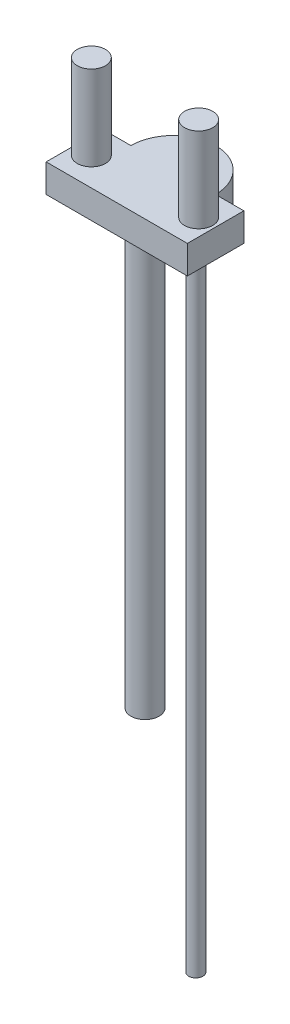
ISO-10303-21;
HEADER;
FILE_DESCRIPTION(('STEP AP214'),'2;1');
FILE_NAME('part.step','',(''),(''),'','','');
FILE_SCHEMA(('AUTOMOTIVE_DESIGN { 1 0 10303 214 1 1 1 1 }'));
ENDSEC;
DATA;
#1=APPLICATION_CONTEXT('core data for automotive mechanical design processes');
#2=APPLICATION_PROTOCOL_DEFINITION('international standard','automotive_design',2000,#1);
#3=PRODUCT_CONTEXT('',#1,'mechanical');
#4=PRODUCT('Part','Part','',(#3));
#5=PRODUCT_RELATED_PRODUCT_CATEGORY('part','',(#4));
#6=PRODUCT_DEFINITION_FORMATION('','',#4);
#7=PRODUCT_DEFINITION_CONTEXT('part definition',#1,'design');
#8=PRODUCT_DEFINITION('design','',#6,#7);
#9=PRODUCT_DEFINITION_SHAPE('','',#8);
#10=(LENGTH_UNIT() NAMED_UNIT(*) SI_UNIT(.MILLI.,.METRE.));
#11=(NAMED_UNIT(*) PLANE_ANGLE_UNIT() SI_UNIT($,.RADIAN.));
#12=(NAMED_UNIT(*) SI_UNIT($,.STERADIAN.) SOLID_ANGLE_UNIT());
#13=UNCERTAINTY_MEASURE_WITH_UNIT(LENGTH_MEASURE(1.E-05),#10,'distance_accuracy_value','');
#14=(GEOMETRIC_REPRESENTATION_CONTEXT(3) GLOBAL_UNCERTAINTY_ASSIGNED_CONTEXT((#13)) GLOBAL_UNIT_ASSIGNED_CONTEXT((#10,
#11,#12)) REPRESENTATION_CONTEXT('',''));
#15=CARTESIAN_POINT('',(0.,0.,0.));
#16=DIRECTION('',(0.,0.,1.));
#17=DIRECTION('',(1.,0.,0.));
#18=AXIS2_PLACEMENT_3D('',#15,#16,#17);
#19=CARTESIAN_POINT('',(-25.,160.,-10.));
#20=DIRECTION('',(0.,0.,1.));
#21=DIRECTION('',(1.,0.,0.));
#22=AXIS2_PLACEMENT_3D('',#19,#20,#21);
#23=PLANE('',#22);
#24=DIRECTION('',(-1.,0.,0.));
#25=VECTOR('',#24,1.);
#26=CARTESIAN_POINT('',(-25.,150.,-10.));
#27=LINE('',#26,#25);
#28=CARTESIAN_POINT('',(25.,150.,-10.));
#29=VERTEX_POINT('',#28);
#30=CARTESIAN_POINT('',(15.,150.,-10.));
#31=VERTEX_POINT('',#30);
#32=EDGE_CURVE('E97',#29,#31,#27,.T.);
#33=ORIENTED_EDGE('',*,*,#32,.T.);
#34=DIRECTION('',(0.,1.,0.));
#35=VECTOR('',#34,1.);
#36=CARTESIAN_POINT('',(15.,150.,-10.));
#37=LINE('',#36,#35);
#38=CARTESIAN_POINT('',(15.,160.,-10.));
#39=VERTEX_POINT('',#38);
#40=EDGE_CURVE('E58',#31,#39,#37,.T.);
#41=ORIENTED_EDGE('',*,*,#40,.T.);
#42=DIRECTION('',(-1.,0.,0.));
#43=VECTOR('',#42,1.);
#44=CARTESIAN_POINT('',(-25.,160.,-10.));
#45=LINE('',#44,#43);
#46=CARTESIAN_POINT('',(25.,160.,-10.));
#47=VERTEX_POINT('',#46);
#48=EDGE_CURVE('E130',#47,#39,#45,.T.);
#49=ORIENTED_EDGE('',*,*,#48,.F.);
#50=DIRECTION('',(0.,-1.,0.));
#51=VECTOR('',#50,1.);
#52=CARTESIAN_POINT('',(25.,160.,-10.));
#53=LINE('',#52,#51);
#54=EDGE_CURVE('E148',#47,#29,#53,.T.);
#55=ORIENTED_EDGE('',*,*,#54,.T.);
#56=EDGE_LOOP('',(#33,#41,#49,#55));
#57=FACE_BOUND('',#56,.T.);
#58=ADVANCED_FACE('F33',(#57),#23,.F.);
#59=CARTESIAN_POINT('',(0.,150.,0.));
#60=DIRECTION('',(0.,-1.,0.));
#61=DIRECTION('',(0.,0.,-1.));
#62=AXIS2_PLACEMENT_3D('',#59,#60,#61);
#63=CYLINDRICAL_SURFACE('',#62,5.);
#64=CARTESIAN_POINT('',(0.,150.,0.));
#65=DIRECTION('',(0.,1.,0.));
#66=DIRECTION('',(0.,0.,1.));
#67=AXIS2_PLACEMENT_3D('',#64,#65,#66);
#68=CIRCLE('',#67,5.);
#69=CARTESIAN_POINT('',(0.,150.,5.));
#70=VERTEX_POINT('',#69);
#71=EDGE_CURVE('E11',#70,#70,#68,.T.);
#72=ORIENTED_EDGE('',*,*,#71,.F.);
#73=EDGE_LOOP('',(#72));
#74=FACE_BOUND('',#73,.T.);
#75=CARTESIAN_POINT('',(0.,0.,0.));
#76=DIRECTION('',(0.,1.,0.));
#77=DIRECTION('',(0.,0.,1.));
#78=AXIS2_PLACEMENT_3D('',#75,#76,#77);
#79=CIRCLE('',#78,5.);
#80=CARTESIAN_POINT('',(0.,0.,5.));
#81=VERTEX_POINT('',#80);
#82=EDGE_CURVE('E42',#81,#81,#79,.T.);
#83=ORIENTED_EDGE('',*,*,#82,.T.);
#84=EDGE_LOOP('',(#83));
#85=FACE_BOUND('',#84,.T.);
#86=ADVANCED_FACE('F35',(#74,#85),#63,.T.);
#87=CARTESIAN_POINT('',(0.,0.,0.));
#88=DIRECTION('',(0.,1.,0.));
#89=DIRECTION('',(0.,0.,1.));
#90=AXIS2_PLACEMENT_3D('',#87,#88,#89);
#91=PLANE('',#90);
#92=ORIENTED_EDGE('',*,*,#82,.F.);
#93=EDGE_LOOP('',(#92));
#94=FACE_BOUND('',#93,.T.);
#95=ADVANCED_FACE('F154',(#94),#91,.F.);
#96=CARTESIAN_POINT('',(25.,160.,-10.));
#97=DIRECTION('',(-1.,0.,0.));
#98=DIRECTION('',(0.,0.,1.));
#99=AXIS2_PLACEMENT_3D('',#96,#97,#98);
#100=PLANE('',#99);
#101=DIRECTION('',(0.,0.,-1.));
#102=VECTOR('',#101,1.);
#103=CARTESIAN_POINT('',(25.,150.,-10.));
#104=LINE('',#103,#102);
#105=CARTESIAN_POINT('',(25.,150.,10.));
#106=VERTEX_POINT('',#105);
#107=EDGE_CURVE('E98',#106,#29,#104,.T.);
#108=ORIENTED_EDGE('',*,*,#107,.T.);
#109=ORIENTED_EDGE('',*,*,#54,.F.);
#110=DIRECTION('',(0.,0.,-1.));
#111=VECTOR('',#110,1.);
#112=CARTESIAN_POINT('',(25.,160.,-10.));
#113=LINE('',#112,#111);
#114=CARTESIAN_POINT('',(25.,160.,10.));
#115=VERTEX_POINT('',#114);
#116=EDGE_CURVE('E126',#115,#47,#113,.T.);
#117=ORIENTED_EDGE('',*,*,#116,.F.);
#118=DIRECTION('',(0.,-1.,0.));
#119=VECTOR('',#118,1.);
#120=CARTESIAN_POINT('',(25.,160.,10.));
#121=LINE('',#120,#119);
#122=EDGE_CURVE('E136',#115,#106,#121,.T.);
#123=ORIENTED_EDGE('',*,*,#122,.T.);
#124=EDGE_LOOP('',(#108,#109,#117,#123));
#125=FACE_BOUND('',#124,.T.);
#126=ADVANCED_FACE('F156',(#125),#100,.F.);
#127=CARTESIAN_POINT('',(-15.,160.,-10.));
#128=VERTEX_POINT('',#127);
#129=CARTESIAN_POINT('',(-25.,160.,-10.));
#130=VERTEX_POINT('',#129);
#131=EDGE_CURVE('E50',#128,#130,#45,.T.);
#132=ORIENTED_EDGE('',*,*,#131,.F.);
#133=DIRECTION('',(0.,1.,0.));
#134=VECTOR('',#133,1.);
#135=CARTESIAN_POINT('',(-15.,150.,-10.));
#136=LINE('',#135,#134);
#137=CARTESIAN_POINT('',(-15.,150.,-10.));
#138=VERTEX_POINT('',#137);
#139=EDGE_CURVE('E100',#138,#128,#136,.T.);
#140=ORIENTED_EDGE('',*,*,#139,.F.);
#141=CARTESIAN_POINT('',(-25.,150.,-10.));
#142=VERTEX_POINT('',#141);
#143=EDGE_CURVE('E89',#138,#142,#27,.T.);
#144=ORIENTED_EDGE('',*,*,#143,.T.);
#145=DIRECTION('',(0.,-1.,0.));
#146=VECTOR('',#145,1.);
#147=CARTESIAN_POINT('',(-25.,160.,-10.));
#148=LINE('',#147,#146);
#149=EDGE_CURVE('E146',#130,#142,#148,.T.);
#150=ORIENTED_EDGE('',*,*,#149,.F.);
#151=EDGE_LOOP('',(#132,#140,#144,#150));
#152=FACE_BOUND('',#151,.T.);
#153=ADVANCED_FACE('F101',(#152),#23,.F.);
#154=CARTESIAN_POINT('',(-25.,160.,-10.));
#155=DIRECTION('',(1.,0.,0.));
#156=DIRECTION('',(0.,0.,-1.));
#157=AXIS2_PLACEMENT_3D('',#154,#155,#156);
#158=PLANE('',#157);
#159=DIRECTION('',(0.,0.,1.));
#160=VECTOR('',#159,1.);
#161=CARTESIAN_POINT('',(-25.,150.,-10.));
#162=LINE('',#161,#160);
#163=CARTESIAN_POINT('',(-25.,150.,10.));
#164=VERTEX_POINT('',#163);
#165=EDGE_CURVE('E95',#142,#164,#162,.T.);
#166=ORIENTED_EDGE('',*,*,#165,.T.);
#167=DIRECTION('',(0.,-1.,0.));
#168=VECTOR('',#167,1.);
#169=CARTESIAN_POINT('',(-25.,160.,10.));
#170=LINE('',#169,#168);
#171=CARTESIAN_POINT('',(-25.,160.,10.));
#172=VERTEX_POINT('',#171);
#173=EDGE_CURVE('E143',#172,#164,#170,.T.);
#174=ORIENTED_EDGE('',*,*,#173,.F.);
#175=DIRECTION('',(0.,0.,1.));
#176=VECTOR('',#175,1.);
#177=CARTESIAN_POINT('',(-25.,160.,-10.));
#178=LINE('',#177,#176);
#179=EDGE_CURVE('E132',#130,#172,#178,.T.);
#180=ORIENTED_EDGE('',*,*,#179,.F.);
#181=ORIENTED_EDGE('',*,*,#149,.T.);
#182=EDGE_LOOP('',(#166,#174,#180,#181));
#183=FACE_BOUND('',#182,.T.);
#184=ADVANCED_FACE('F170',(#183),#158,.F.);
#185=CARTESIAN_POINT('',(-25.,160.,10.));
#186=DIRECTION('',(0.,0.,-1.));
#187=DIRECTION('',(-1.,0.,0.));
#188=AXIS2_PLACEMENT_3D('',#185,#186,#187);
#189=PLANE('',#188);
#190=DIRECTION('',(1.,0.,0.));
#191=VECTOR('',#190,1.);
#192=CARTESIAN_POINT('',(-25.,150.,10.));
#193=LINE('',#192,#191);
#194=EDGE_CURVE('E129',#164,#106,#193,.T.);
#195=ORIENTED_EDGE('',*,*,#194,.T.);
#196=ORIENTED_EDGE('',*,*,#122,.F.);
#197=DIRECTION('',(1.,0.,0.));
#198=VECTOR('',#197,1.);
#199=CARTESIAN_POINT('',(-25.,160.,10.));
#200=LINE('',#199,#198);
#201=EDGE_CURVE('E134',#172,#115,#200,.T.);
#202=ORIENTED_EDGE('',*,*,#201,.F.);
#203=ORIENTED_EDGE('',*,*,#173,.T.);
#204=EDGE_LOOP('',(#195,#196,#202,#203));
#205=FACE_BOUND('',#204,.T.);
#206=ADVANCED_FACE('F174',(#205),#189,.F.);
#207=CARTESIAN_POINT('',(0.,160.,0.));
#208=DIRECTION('',(0.,1.,0.));
#209=DIRECTION('',(0.,0.,1.));
#210=AXIS2_PLACEMENT_3D('',#207,#208,#209);
#211=PLANE('',#210);
#212=CARTESIAN_POINT('',(19.,160.,0.));
#213=DIRECTION('',(0.,1.,0.));
#214=DIRECTION('',(0.,0.,1.));
#215=AXIS2_PLACEMENT_3D('',#212,#213,#214);
#216=CIRCLE('',#215,5.);
#217=CARTESIAN_POINT('',(19.,160.,5.));
#218=VERTEX_POINT('',#217);
#219=EDGE_CURVE('E113',#218,#218,#216,.T.);
#220=ORIENTED_EDGE('',*,*,#219,.F.);
#221=EDGE_LOOP('',(#220));
#222=FACE_BOUND('',#221,.T.);
#223=CARTESIAN_POINT('',(-19.,160.,0.));
#224=DIRECTION('',(0.,1.,0.));
#225=DIRECTION('',(0.,0.,1.));
#226=AXIS2_PLACEMENT_3D('',#223,#224,#225);
#227=CIRCLE('',#226,5.);
#228=CARTESIAN_POINT('',(-19.,160.,5.));
#229=VERTEX_POINT('',#228);
#230=EDGE_CURVE('E118',#229,#229,#227,.T.);
#231=ORIENTED_EDGE('',*,*,#230,.F.);
#232=EDGE_LOOP('',(#231));
#233=FACE_BOUND('',#232,.T.);
#234=ORIENTED_EDGE('',*,*,#116,.T.);
#235=ORIENTED_EDGE('',*,*,#48,.T.);
#236=CARTESIAN_POINT('',(0.,160.,-10.));
#237=DIRECTION('',(0.,1.,0.));
#238=DIRECTION('',(0.,0.,1.));
#239=AXIS2_PLACEMENT_3D('',#236,#237,#238);
#240=CIRCLE('',#239,15.);
#241=EDGE_CURVE('E107',#39,#128,#240,.T.);
#242=ORIENTED_EDGE('',*,*,#241,.T.);
#243=ORIENTED_EDGE('',*,*,#131,.T.);
#244=ORIENTED_EDGE('',*,*,#179,.T.);
#245=ORIENTED_EDGE('',*,*,#201,.T.);
#246=EDGE_LOOP('',(#234,#235,#242,#243,#244,#245));
#247=FACE_BOUND('',#246,.T.);
#248=ADVANCED_FACE('F179',(#222,#233,#247),#211,.T.);
#249=CARTESIAN_POINT('',(0.,150.,0.));
#250=DIRECTION('',(0.,1.,0.));
#251=DIRECTION('',(0.,0.,1.));
#252=AXIS2_PLACEMENT_3D('',#249,#250,#251);
#253=PLANE('',#252);
#254=CARTESIAN_POINT('',(0.,150.,-18.));
#255=DIRECTION('',(0.,1.,0.));
#256=DIRECTION('',(0.,0.,1.));
#257=AXIS2_PLACEMENT_3D('',#254,#255,#256);
#258=CIRCLE('',#257,2.5);
#259=CARTESIAN_POINT('',(0.,150.,-15.5));
#260=VERTEX_POINT('',#259);
#261=EDGE_CURVE('E37',#260,#260,#258,.T.);
#262=ORIENTED_EDGE('',*,*,#261,.T.);
#263=EDGE_LOOP('',(#262));
#264=FACE_BOUND('',#263,.T.);
#265=ORIENTED_EDGE('',*,*,#71,.T.);
#266=EDGE_LOOP('',(#265));
#267=FACE_BOUND('',#266,.T.);
#268=ORIENTED_EDGE('',*,*,#107,.F.);
#269=ORIENTED_EDGE('',*,*,#194,.F.);
#270=ORIENTED_EDGE('',*,*,#165,.F.);
#271=ORIENTED_EDGE('',*,*,#143,.F.);
#272=CARTESIAN_POINT('',(0.,150.,-10.));
#273=DIRECTION('',(0.,1.,0.));
#274=DIRECTION('',(0.,0.,1.));
#275=AXIS2_PLACEMENT_3D('',#272,#273,#274);
#276=CIRCLE('',#275,15.);
#277=EDGE_CURVE('E93',#31,#138,#276,.T.);
#278=ORIENTED_EDGE('',*,*,#277,.F.);
#279=ORIENTED_EDGE('',*,*,#32,.F.);
#280=EDGE_LOOP('',(#268,#269,#270,#271,#278,#279));
#281=FACE_BOUND('',#280,.T.);
#282=ADVANCED_FACE('F91',(#264,#267,#281),#253,.F.);
#283=CARTESIAN_POINT('',(-19.,190.,0.));
#284=DIRECTION('',(0.,-1.,0.));
#285=DIRECTION('',(0.,0.,-1.));
#286=AXIS2_PLACEMENT_3D('',#283,#284,#285);
#287=CYLINDRICAL_SURFACE('',#286,5.);
#288=CARTESIAN_POINT('',(-19.,190.,0.));
#289=DIRECTION('',(0.,1.,0.));
#290=DIRECTION('',(0.,0.,1.));
#291=AXIS2_PLACEMENT_3D('',#288,#289,#290);
#292=CIRCLE('',#291,5.);
#293=CARTESIAN_POINT('',(-19.,190.,5.));
#294=VERTEX_POINT('',#293);
#295=EDGE_CURVE('E121',#294,#294,#292,.T.);
#296=ORIENTED_EDGE('',*,*,#295,.F.);
#297=EDGE_LOOP('',(#296));
#298=FACE_BOUND('',#297,.T.);
#299=ORIENTED_EDGE('',*,*,#230,.T.);
#300=EDGE_LOOP('',(#299));
#301=FACE_BOUND('',#300,.T.);
#302=ADVANCED_FACE('F185',(#298,#301),#287,.T.);
#303=CARTESIAN_POINT('',(-19.,190.,0.));
#304=DIRECTION('',(0.,1.,0.));
#305=DIRECTION('',(0.,0.,1.));
#306=AXIS2_PLACEMENT_3D('',#303,#304,#305);
#307=PLANE('',#306);
#308=ORIENTED_EDGE('',*,*,#295,.T.);
#309=EDGE_LOOP('',(#308));
#310=FACE_BOUND('',#309,.T.);
#311=ADVANCED_FACE('F192',(#310),#307,.T.);
#312=CARTESIAN_POINT('',(19.,190.,0.));
#313=DIRECTION('',(0.,-1.,0.));
#314=DIRECTION('',(0.,0.,-1.));
#315=AXIS2_PLACEMENT_3D('',#312,#313,#314);
#316=CYLINDRICAL_SURFACE('',#315,5.);
#317=CARTESIAN_POINT('',(19.,190.,0.));
#318=DIRECTION('',(0.,1.,0.));
#319=DIRECTION('',(0.,0.,1.));
#320=AXIS2_PLACEMENT_3D('',#317,#318,#319);
#321=CIRCLE('',#320,5.);
#322=CARTESIAN_POINT('',(19.,190.,5.));
#323=VERTEX_POINT('',#322);
#324=EDGE_CURVE('E115',#323,#323,#321,.T.);
#325=ORIENTED_EDGE('',*,*,#324,.F.);
#326=EDGE_LOOP('',(#325));
#327=FACE_BOUND('',#326,.T.);
#328=ORIENTED_EDGE('',*,*,#219,.T.);
#329=EDGE_LOOP('',(#328));
#330=FACE_BOUND('',#329,.T.);
#331=ADVANCED_FACE('F196',(#327,#330),#316,.T.);
#332=CARTESIAN_POINT('',(19.,190.,0.));
#333=DIRECTION('',(0.,1.,0.));
#334=DIRECTION('',(0.,0.,1.));
#335=AXIS2_PLACEMENT_3D('',#332,#333,#334);
#336=PLANE('',#335);
#337=ORIENTED_EDGE('',*,*,#324,.T.);
#338=EDGE_LOOP('',(#337));
#339=FACE_BOUND('',#338,.T.);
#340=ADVANCED_FACE('F200',(#339),#336,.T.);
#341=CARTESIAN_POINT('',(0.,150.,-10.));
#342=DIRECTION('',(0.,1.,0.));
#343=DIRECTION('',(0.,0.,1.));
#344=AXIS2_PLACEMENT_3D('',#341,#342,#343);
#345=CYLINDRICAL_SURFACE('',#344,15.);
#346=ORIENTED_EDGE('',*,*,#241,.F.);
#347=ORIENTED_EDGE('',*,*,#40,.F.);
#348=ORIENTED_EDGE('',*,*,#277,.T.);
#349=ORIENTED_EDGE('',*,*,#139,.T.);
#350=EDGE_LOOP('',(#346,#347,#348,#349));
#351=FACE_BOUND('',#350,.T.);
#352=ADVANCED_FACE('F106',(#351),#345,.T.);
#353=CARTESIAN_POINT('',(0.,-90.0000000000001,-18.));
#354=DIRECTION('',(0.,1.,0.));
#355=DIRECTION('',(0.,0.,1.));
#356=AXIS2_PLACEMENT_3D('',#353,#354,#355);
#357=CYLINDRICAL_SURFACE('',#356,2.5);
#358=CARTESIAN_POINT('',(0.,-90.0000000000001,-18.));
#359=DIRECTION('',(0.,1.,0.));
#360=DIRECTION('',(0.,0.,1.));
#361=AXIS2_PLACEMENT_3D('',#358,#359,#360);
#362=CIRCLE('',#361,2.5);
#363=CARTESIAN_POINT('',(0.,-90.0000000000001,-15.5));
#364=VERTEX_POINT('',#363);
#365=EDGE_CURVE('E111',#364,#364,#362,.T.);
#366=ORIENTED_EDGE('',*,*,#365,.T.);
#367=EDGE_LOOP('',(#366));
#368=FACE_BOUND('',#367,.T.);
#369=ORIENTED_EDGE('',*,*,#261,.F.);
#370=EDGE_LOOP('',(#369));
#371=FACE_BOUND('',#370,.T.);
#372=ADVANCED_FACE('F207',(#368,#371),#357,.T.);
#373=CARTESIAN_POINT('',(0.,-90.0000000000001,-18.));
#374=DIRECTION('',(0.,1.,0.));
#375=DIRECTION('',(0.,0.,1.));
#376=AXIS2_PLACEMENT_3D('',#373,#374,#375);
#377=PLANE('',#376);
#378=ORIENTED_EDGE('',*,*,#365,.F.);
#379=EDGE_LOOP('',(#378));
#380=FACE_BOUND('',#379,.T.);
#381=ADVANCED_FACE('F210',(#380),#377,.F.);
#382=CLOSED_SHELL('',(#58,#86,#95,#126,#153,#184,#206,#248,#282,#302,#311,#331,#340,#352,#372,#381));
#383=MANIFOLD_SOLID_BREP('B2',#382);
#384=ADVANCED_BREP_SHAPE_REPRESENTATION('',(#18,#383),#14);
#385=SHAPE_DEFINITION_REPRESENTATION(#9,#384);
ENDSEC;
END-ISO-10303-21;
